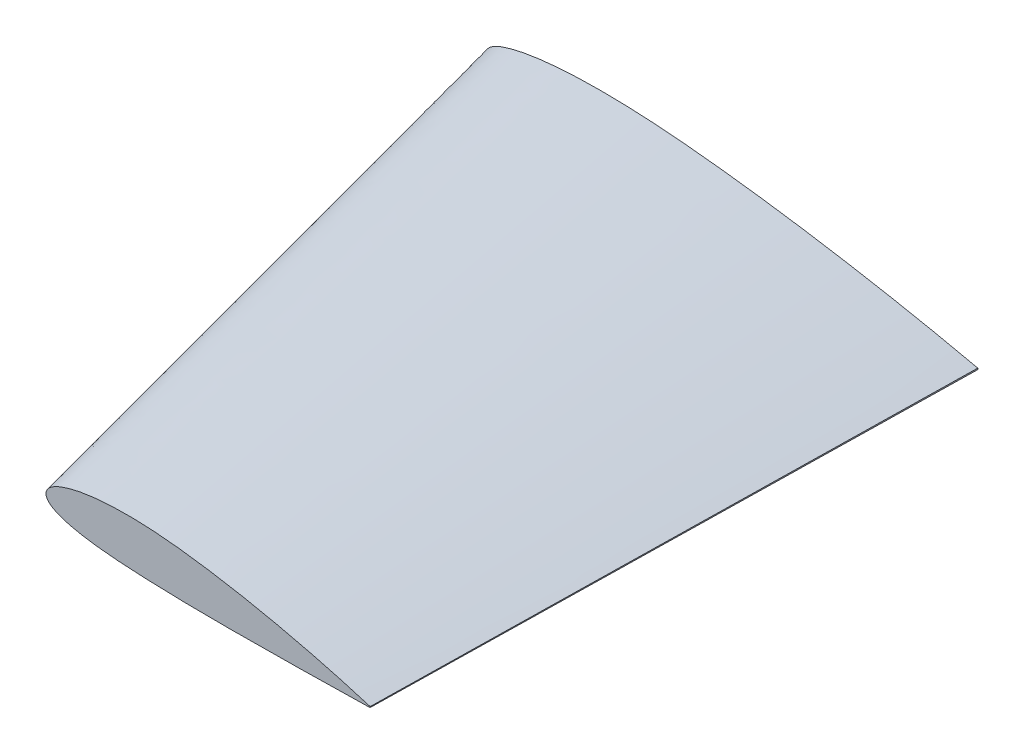
ISO-10303-21;
HEADER;
FILE_DESCRIPTION(('STEP AP214'),'2;1');
FILE_NAME('part.step','',(''),(''),'','','');
FILE_SCHEMA(('AUTOMOTIVE_DESIGN { 1 0 10303 214 1 1 1 1 }'));
ENDSEC;
DATA;
#1=APPLICATION_CONTEXT('core data for automotive mechanical design processes');
#2=APPLICATION_PROTOCOL_DEFINITION('international standard','automotive_design',2000,#1);
#3=PRODUCT_CONTEXT('',#1,'mechanical');
#4=PRODUCT('Part','Part','',(#3));
#5=PRODUCT_RELATED_PRODUCT_CATEGORY('part','',(#4));
#6=PRODUCT_DEFINITION_FORMATION('','',#4);
#7=PRODUCT_DEFINITION_CONTEXT('part definition',#1,'design');
#8=PRODUCT_DEFINITION('design','',#6,#7);
#9=PRODUCT_DEFINITION_SHAPE('','',#8);
#10=(LENGTH_UNIT() NAMED_UNIT(*) SI_UNIT(.MILLI.,.METRE.));
#11=(NAMED_UNIT(*) PLANE_ANGLE_UNIT() SI_UNIT($,.RADIAN.));
#12=(NAMED_UNIT(*) SI_UNIT($,.STERADIAN.) SOLID_ANGLE_UNIT());
#13=UNCERTAINTY_MEASURE_WITH_UNIT(LENGTH_MEASURE(1.E-05),#10,'distance_accuracy_value','');
#14=(GEOMETRIC_REPRESENTATION_CONTEXT(3) GLOBAL_UNCERTAINTY_ASSIGNED_CONTEXT((#13)) GLOBAL_UNIT_ASSIGNED_CONTEXT((#10,
#11,#12)) REPRESENTATION_CONTEXT('',''));
#15=CARTESIAN_POINT('',(0.,0.,0.));
#16=DIRECTION('',(0.,0.,1.));
#17=DIRECTION('',(1.,0.,0.));
#18=AXIS2_PLACEMENT_3D('',#15,#16,#17);
#19=CARTESIAN_POINT('',(119.746151,-7.122289,75.));
#20=DIRECTION('',(-0.997563929784599,0.0697551722889902,-0.000649562653087611));
#21=DIRECTION('',(-0.069755187004952,-0.997564140236558,0.));
#22=AXIS2_PLACEMENT_3D('',#19,#20,#21);
#23=PLANE('',#22);
#24=DIRECTION('',(-0.0679695166424708,-0.974038223353683,-0.215939075327717));
#25=VECTOR('',#24,1.);
#26=CARTESIAN_POINT('',(120.887478722001,8.53859711326182,3.99906070157637));
#27=LINE('',#26,#25);
#28=CARTESIAN_POINT('',(119.720171777671,-8.18951629942968,0.290527241897001));
#29=VERTEX_POINT('',#28);
#30=CARTESIAN_POINT('',(119.69552466197,-8.54271626447592,0.212224694800589));
#31=VERTEX_POINT('',#30);
#32=EDGE_CURVE('E65',#29,#31,#27,.T.);
#33=ORIENTED_EDGE('',*,*,#32,.F.);
#34=DIRECTION('',(-0.000622136728806466,-0.0182076642969266,-0.999834033180878));
#35=VECTOR('',#34,1.);
#36=CARTESIAN_POINT('',(119.813327,-5.463204,150.));
#37=LINE('',#36,#35);
#38=CARTESIAN_POINT('',(119.813327,-5.463204,150.));
#39=VERTEX_POINT('',#38);
#40=EDGE_CURVE('E59',#39,#29,#37,.T.);
#41=ORIENTED_EDGE('',*,*,#40,.F.);
#42=DIRECTION('',(0.0697534354277137,0.997564262714955,0.));
#43=VECTOR('',#42,1.);
#44=CARTESIAN_POINT('',(119.813327,-5.463204,150.));
#45=LINE('',#44,#43);
#46=CARTESIAN_POINT('',(119.796921,-5.697831,150.));
#47=VERTEX_POINT('',#46);
#48=EDGE_CURVE('E85',#47,#39,#45,.T.);
#49=ORIENTED_EDGE('',*,*,#48,.F.);
#50=DIRECTION('',(-0.000676811117803588,-0.018989344322322,-0.999819457066584));
#51=VECTOR('',#50,1.);
#52=CARTESIAN_POINT('',(119.796921,-5.697831,150.));
#53=LINE('',#52,#51);
#54=EDGE_CURVE('E71',#47,#31,#53,.T.);
#55=ORIENTED_EDGE('',*,*,#54,.T.);
#56=EDGE_LOOP('',(#33,#41,#49,#55));
#57=FACE_BOUND('',#56,.T.);
#58=ADVANCED_FACE('F43',(#57),#23,.F.);
#59=CARTESIAN_POINT('',(119.796921,-5.697831,150.));
#60=CARTESIAN_POINT('',(119.695381,-8.546747,0.));
#61=CARTESIAN_POINT('',(119.720089077011,-5.69935452836217,150.));
#62=CARTESIAN_POINT('',(119.580133447658,-8.54903190357948,0.));
#63=CARTESIAN_POINT('',(119.421762984659,-5.70527014579291,150.));
#64=CARTESIAN_POINT('',(119.132644447681,-8.55790384226315,0.));
#65=CARTESIAN_POINT('',(118.757216412402,-5.72393937630763,150.));
#66=CARTESIAN_POINT('',(118.135824981888,-8.58591002334622,0.));
#67=CARTESIAN_POINT('',(117.66284283727,-5.74929339736574,150.));
#68=CARTESIAN_POINT('',(116.494264736278,-8.62393892136286,0.));
#69=CARTESIAN_POINT('',(116.148527112868,-5.78460306429084,150.));
#70=CARTESIAN_POINT('',(114.222791176919,-8.67690443308632,0.));
#71=CARTESIAN_POINT('',(114.232196894729,-5.82484575443327,150.));
#72=CARTESIAN_POINT('',(111.348295660329,-8.73726773433215,0.));
#73=CARTESIAN_POINT('',(111.935984539278,-5.87166832078484,150.));
#74=CARTESIAN_POINT('',(107.903976990949,-8.80750339244512,0.));
#75=CARTESIAN_POINT('',(109.286424235353,-5.92035016143558,150.));
#76=CARTESIAN_POINT('',(103.929636690098,-8.88052584285175,0.));
#77=CARTESIAN_POINT('',(106.313577028821,-5.96913257272703,150.));
#78=CARTESIAN_POINT('',(99.4703658606835,-8.95369832847564,0.));
#79=CARTESIAN_POINT('',(103.051288706592,-6.01950807917383,150.));
#80=CARTESIAN_POINT('',(94.5769335764924,-9.02926375966119,0.));
#81=CARTESIAN_POINT('',(99.5362533327051,-6.06691487761388,150.));
#82=CARTESIAN_POINT('',(89.3043799910391,-9.10037234590575,0.));
#83=CARTESIAN_POINT('',(95.807941331968,-6.10967344012256,150.));
#84=CARTESIAN_POINT('',(83.7119118428322,-9.16451141714926,0.));
#85=CARTESIAN_POINT('',(91.9077441613682,-6.14687179253826,150.));
#86=CARTESIAN_POINT('',(77.8616153918016,-9.22030545810688,0.));
#87=CARTESIAN_POINT('',(87.8789595605144,-6.17278199399079,150.));
#88=CARTESIAN_POINT('',(71.8184388502869,-9.25917464918181,0.));
#89=CARTESIAN_POINT('',(83.7657819445168,-6.18110519907024,150.));
#90=CARTESIAN_POINT('',(65.6486724152118,-9.27165644033003,0.));
#91=CARTESIAN_POINT('',(79.613582340364,-6.16908728967109,150.));
#92=CARTESIAN_POINT('',(59.4203736815377,-9.25363167642656,0.));
#93=CARTESIAN_POINT('',(75.4685289214045,-6.12536899779459,150.));
#94=CARTESIAN_POINT('',(53.2027935297466,-9.18805490680717,0.));
#95=CARTESIAN_POINT('',(71.3878041455055,-6.03697014164122,150.));
#96=CARTESIAN_POINT('',(47.0817064028677,-9.05545478317383,0.));
#97=CARTESIAN_POINT('',(67.4141765351794,-5.92082268573018,150.));
#98=CARTESIAN_POINT('',(41.121264782632,-8.8812343987991,0.));
#99=CARTESIAN_POINT('',(63.5881846045579,-5.77311634705813,150.));
#100=CARTESIAN_POINT('',(35.3822767744536,-8.65967359861637,0.));
#101=CARTESIAN_POINT('',(59.9370733704736,-5.58168107930895,150.));
#102=CARTESIAN_POINT('',(29.9056098858254,-8.37252176780058,0.));
#103=CARTESIAN_POINT('',(56.4981390961885,-5.33465478889035,150.));
#104=CARTESIAN_POINT('',(24.7472081644949,-8.00198251563046,0.));
#105=CARTESIAN_POINT('',(53.306583026596,-5.02653238455898,150.));
#106=CARTESIAN_POINT('',(19.9598742758701,-7.53980000516498,0.));
#107=CARTESIAN_POINT('',(50.3951572901005,-4.65027819780019,150.));
#108=CARTESIAN_POINT('',(15.5927358514262,-6.97541745438635,0.));
#109=CARTESIAN_POINT('',(47.7944372518907,-4.2026716769138,150.));
#110=CARTESIAN_POINT('',(11.6916562954461,-6.30400554721834,0.));
#111=CARTESIAN_POINT('',(45.5309277851159,-3.68571045475573,150.));
#112=CARTESIAN_POINT('',(8.29639119290956,-5.52856724051208,0.));
#113=CARTESIAN_POINT('',(43.6283920681246,-3.09999534114925,150.));
#114=CARTESIAN_POINT('',(5.44258821000201,-4.64999205017269,0.));
#115=CARTESIAN_POINT('',(42.1035247735245,-2.44883989394221,150.));
#116=CARTESIAN_POINT('',(3.15528662789996,-3.67326082160026,0.));
#117=CARTESIAN_POINT('',(40.9645845449649,-1.73486529894164,150.));
#118=CARTESIAN_POINT('',(1.44687693909117,-2.60229725979838,0.));
#119=CARTESIAN_POINT('',(40.2106547036615,-0.931371815462063,150.));
#120=CARTESIAN_POINT('',(0.315982361489284,-1.39705764245588,0.));
#121=CARTESIAN_POINT('',(39.9162153889077,-0.0026750776734886,150.));
#122=CARTESIAN_POINT('',(-0.125677219466628,-0.0040124729912952,0.));
#123=CARTESIAN_POINT('',(40.1556330428731,0.943576027642244,150.));
#124=CARTESIAN_POINT('',(0.233450762508598,1.4153633849593,0.));
#125=CARTESIAN_POINT('',(40.8708763287822,1.78941441957464,150.));
#126=CARTESIAN_POINT('',(1.30631319626383,2.68412251043723,0.));
#127=CARTESIAN_POINT('',(41.986695646897,2.56271001563297,150.));
#128=CARTESIAN_POINT('',(2.9800433907782,3.84406495500664,0.));
#129=CARTESIAN_POINT('',(43.5103075643543,3.27849474912423,150.));
#130=CARTESIAN_POINT('',(5.26546161540701,4.91774163457337,0.));
#131=CARTESIAN_POINT('',(45.4347150322575,3.92547747289718,150.));
#132=CARTESIAN_POINT('',(8.1520728952497,5.88821562020073,0.));
#133=CARTESIAN_POINT('',(47.7453694398953,4.48816110644685,150.));
#134=CARTESIAN_POINT('',(11.6180537630873,6.73224369012464,0.));
#135=CARTESIAN_POINT('',(50.41954469606,4.94538084704893,150.));
#136=CARTESIAN_POINT('',(15.6293171010849,7.41807009203779,0.));
#137=CARTESIAN_POINT('',(53.4269982165544,5.28367379004639,150.));
#138=CARTESIAN_POINT('',(20.140497454147,7.92551034662008,0.));
#139=CARTESIAN_POINT('',(56.7334090785526,5.48468537559014,150.));
#140=CARTESIAN_POINT('',(25.1001141297721,8.22702753372264,0.));
#141=CARTESIAN_POINT('',(60.299715648689,5.54326626088376,150.));
#142=CARTESIAN_POINT('',(30.4495739660976,8.31489879604682,0.));
#143=CARTESIAN_POINT('',(64.0839236547042,5.45152021336018,150.));
#144=CARTESIAN_POINT('',(36.1258856305697,8.17728027790546,0.));
#145=CARTESIAN_POINT('',(68.0413704755695,5.20987884504357,150.));
#146=CARTESIAN_POINT('',(42.0620559623822,7.81481919178412,0.));
#147=CARTESIAN_POINT('',(72.1128083068471,4.82016044703043,150.));
#148=CARTESIAN_POINT('',(48.1692120249969,7.23023970471234,0.));
#149=CARTESIAN_POINT('',(76.2514681863848,4.30472481999823,150.));
#150=CARTESIAN_POINT('',(54.3772018868441,6.45708768257762,0.));
#151=CARTESIAN_POINT('',(80.4133766567728,3.6988830468301,150.));
#152=CARTESIAN_POINT('',(60.6200639533861,5.54832331762684,0.));
#153=CARTESIAN_POINT('',(84.5647854813308,3.01562823356003,150.));
#154=CARTESIAN_POINT('',(66.8471778222922,4.52344373053195,0.));
#155=CARTESIAN_POINT('',(88.6603769940206,2.26722795118617,150.));
#156=CARTESIAN_POINT('',(72.990565092582,3.40084068052255,0.));
#157=CARTESIAN_POINT('',(92.6565544288856,1.47543602771966,150.));
#158=CARTESIAN_POINT('',(78.9848320738078,2.21315438368954,0.));
#159=CARTESIAN_POINT('',(96.5094641766712,0.655201797892603,150.));
#160=CARTESIAN_POINT('',(84.764196939048,0.982802719350695,0.));
#161=CARTESIAN_POINT('',(100.17776634055,-0.176288324365056,150.));
#162=CARTESIAN_POINT('',(90.2666500704411,-0.264432397003351,0.));
#163=CARTESIAN_POINT('',(103.622345902392,-1.00020031780073,150.));
#164=CARTESIAN_POINT('',(95.4335189038481,-1.50030080188002,0.));
#165=CARTESIAN_POINT('',(106.806987105637,-1.80007772210247,150.));
#166=CARTESIAN_POINT('',(100.210480041861,-2.7001181734663,0.));
#167=CARTESIAN_POINT('',(109.698241242375,-2.55722145338107,150.));
#168=CARTESIAN_POINT('',(104.547361928777,-3.83583180699834,0.));
#169=CARTESIAN_POINT('',(112.265941349969,-3.25614582850597,150.));
#170=CARTESIAN_POINT('',(108.398911724082,-4.88421939079952,0.));
#171=CARTESIAN_POINT('',(114.48401058316,-3.87986071176615,150.));
#172=CARTESIAN_POINT('',(111.726015897125,-5.81979074766135,0.));
#173=CARTESIAN_POINT('',(116.329109586423,-4.41525579663681,150.));
#174=CARTESIAN_POINT('',(114.493663788704,-6.62288473287829,0.));
#175=CARTESIAN_POINT('',(117.784271886205,-4.84544497409724,150.));
#176=CARTESIAN_POINT('',(116.676407838735,-7.26816704686535,0.));
#177=CARTESIAN_POINT('',(118.83319885077,-5.16335412260416,150.));
#178=CARTESIAN_POINT('',(118.249798126664,-7.74503165761921,0.));
#179=CARTESIAN_POINT('',(119.465681012099,-5.3525808975048,150.));
#180=CARTESIAN_POINT('',(119.198521990126,-8.02887071528418,0.));
#181=CARTESIAN_POINT('',(119.745098710523,-5.44149333650167,150.));
#182=CARTESIAN_POINT('',(119.617648410054,-8.16224063685609,0.));
#183=CARTESIAN_POINT('',(119.813327,-5.463204,150.));
#184=CARTESIAN_POINT('',(119.719991,-8.194807,0.));
#185=B_SPLINE_SURFACE_WITH_KNOTS('',3,1,((#59,#60),(#61,#62),(#63,#64),(#65,#66),(#67,#68),(#69,
#70),(#71,#72),(#73,#74),(#75,#76),(#77,#78),(#79,#80),(#81,#82),(#83,#84),(#85,#86),(#87,#88),
(#89,#90),(#91,#92),(#93,#94),(#95,#96),(#97,#98),(#99,#100),(#101,#102),(#103,#104),(#105,
#106),(#107,#108),(#109,#110),(#111,#112),(#113,#114),(#115,#116),(#117,#118),(#119,#120),(#121,
#122),(#123,#124),(#125,#126),(#127,#128),(#129,#130),(#131,#132),(#133,#134),(#135,#136),(#137,
#138),(#139,#140),(#141,#142),(#143,#144),(#145,#146),(#147,#148),(#149,#150),(#151,#152),(#153,
#154),(#155,#156),(#157,#158),(#159,#160),(#161,#162),(#163,#164),(#165,#166),(#167,#168),(#169,
#170),(#171,#172),(#173,#174),(#175,#176),(#177,#178),(#179,#180),(#181,#182),(#183,#184)),
.UNSPECIFIED.,.F.,.F.,.F.,(4,1,1,1,1,1,1,1,1,1,1,1,1,1,1,1,1,1,1,1,1,1,1,1,1,1,1,1,1,1,1,1,1,1,
1,1,1,1,1,1,1,1,1,1,1,1,1,1,1,1,1,1,1,1,1,1,1,1,1,1,4),(2,2),(0.,0.00140426639984959,
0.00545255629466779,0.0121483441268653,0.0214077993242185,0.0331320979429333,0.0471743381029762,
0.063376631995686,0.0815572838841061,0.101506317964811,0.122997537633434,0.145795502458062,
0.169640520657042,0.19427144542702,0.219417320947617,0.244803050944842,0.270147100785102,
0.295165349773602,0.319388981425358,0.342790032185736,0.365130697804628,0.386196622663306,
0.40578881072802,0.423715600027115,0.439829198130156,0.453994653991293,0.466115133872475,
0.47616233382913,0.484210204133662,0.490546973712714,0.495899701559383,0.501250622448549,
0.507608162128308,0.515724252713546,0.525914787285248,0.538268455651865,0.552769477827439,
0.569329859155209,0.587812276369091,0.608046386738343,0.629838472377957,0.652971156465722,
0.677200621541474,0.702274678093705,0.727698166522235,0.753405905054719,0.779124875485229,
0.80457568680284,0.829483129372504,0.853566604409608,0.876557773414219,0.898214996265898,
0.91828564740033,0.936559103667118,0.952829355966221,0.966913380007166,0.97866270037821,
0.987936590949606,0.994641798372105,0.998691630481928,1.),(0.,1.),.UNSPECIFIED.);
#186=CARTESIAN_POINT('',(119.720171777671,-8.18951629942968,0.290527241897001));
#187=CARTESIAN_POINT('',(119.682011862439,-8.17732486126337,0.293230018668413));
#188=CARTESIAN_POINT('',(119.643852419115,-8.16513183169179,0.295933148245879));
#189=CARTESIAN_POINT('',(119.567518355628,-8.14079077391738,0.301329430837549));
#190=CARTESIAN_POINT('',(119.529343735417,-8.12864274585608,0.304022583820375));
#191=CARTESIAN_POINT('',(119.452964115157,-8.10444016735785,0.30938816629563));
#192=CARTESIAN_POINT('',(119.414759115659,-8.09238561526516,0.31206059615513));
#193=CARTESIAN_POINT('',(119.338309414249,-8.06839732846219,0.317378671305297));
#194=CARTESIAN_POINT('',(119.300064712399,-8.05646359356874,0.320024316636572));
#195=CARTESIAN_POINT('',(119.185284144146,-8.02081144931929,0.32792820672845));
#196=CARTESIAN_POINT('',(119.108699912114,-7.99724149846271,0.333153539032109));
#197=CARTESIAN_POINT('',(118.955444323165,-7.95037255405629,0.343544133850721));
#198=CARTESIAN_POINT('',(118.87877296582,-7.92707356184019,0.348709396069991));
#199=CARTESIAN_POINT('',(118.725384590885,-7.88062098834096,0.359007683680798));
#200=CARTESIAN_POINT('',(118.648667573547,-7.85746740626288,0.364140709248574));
#201=CARTESIAN_POINT('',(118.49523357753,-7.81116062463915,0.374406675578725));
#202=CARTESIAN_POINT('',(118.418516598851,-7.78800742509291,0.379539616341235));
#203=CARTESIAN_POINT('',(118.188387839244,-7.71847402845557,0.394954799251167));
#204=CARTESIAN_POINT('',(118.034999347572,-7.67202036804985,0.405253327823341));
#205=CARTESIAN_POINT('',(117.72822272972,-7.57908779440366,0.425855983386374));
#206=CARTESIAN_POINT('',(117.574834603878,-7.53260888010469,0.436160110611894));
#207=CARTESIAN_POINT('',(117.268028686261,-7.43974551293174,0.456747423469188));
#208=CARTESIAN_POINT('',(117.114610894554,-7.39336105984609,0.467030609147888));
#209=CARTESIAN_POINT('',(116.65423809528,-7.25458086505628,0.497797437613337));
#210=CARTESIAN_POINT('',(116.347164843475,-7.16255864770561,0.518198272044555));
#211=CARTESIAN_POINT('',(115.732707101145,-6.9793742464009,0.55880927609325));
#212=CARTESIAN_POINT('',(115.425322576128,-6.88821217284901,0.579019421235161));
#213=CARTESIAN_POINT('',(114.810355598084,-6.70652637717675,0.619298192413731));
#214=CARTESIAN_POINT('',(114.502773144892,-6.61600265559362,0.639366818331287));
#215=CARTESIAN_POINT('',(113.579751153644,-6.3453228521322,0.699375086043924));
#216=CARTESIAN_POINT('',(112.964036757873,-6.16605806430005,0.739117132706129));
#217=CARTESIAN_POINT('',(111.73168031644,-5.81057995421876,0.817924732397547));
#218=CARTESIAN_POINT('',(111.115038265603,-5.63436664906721,0.856990281636317));
#219=CARTESIAN_POINT('',(109.880879149434,-5.28488690099267,0.934468076486239));
#220=CARTESIAN_POINT('',(109.263362083968,-5.11162045852704,0.972880321995998));
#221=CARTESIAN_POINT('',(108.027605872214,-4.76777196842112,1.04910969701031));
#222=CARTESIAN_POINT('',(107.409366797433,-4.59718967576341,1.08692688083392));
#223=CARTESIAN_POINT('',(106.172115547931,-4.25871926033137,1.16196396539774));
#224=CARTESIAN_POINT('',(105.553103373518,-4.09083113648141,1.19918386637641));
#225=CARTESIAN_POINT('',(104.314307450816,-3.75777310276794,1.27302105480104));
#226=CARTESIAN_POINT('',(103.694523696955,-3.59260321266034,1.30963833786721));
#227=CARTESIAN_POINT('',(102.454217260856,-3.26492807199017,1.38228216763456));
#228=CARTESIAN_POINT('',(101.833694577877,-3.10242282410359,1.41830871374248));
#229=CARTESIAN_POINT('',(100.384827038029,-2.72621196975097,1.50171265218079));
#230=CARTESIAN_POINT('',(99.556208426393,-2.51351051920872,1.54886742850242));
#231=CARTESIAN_POINT('',(97.8977442221683,-2.09271621527874,1.64215527975425));
#232=CARTESIAN_POINT('',(97.0678986290759,-1.88462336378143,1.68828835426535));
#233=CARTESIAN_POINT('',(95.4069658152783,-1.47315990282839,1.77950760743123));
#234=CARTESIAN_POINT('',(94.5758785754491,-1.26978936692076,1.82459376978078));
#235=CARTESIAN_POINT('',(92.9125072443845,-0.86777296969915,1.91371865933976));
#236=CARTESIAN_POINT('',(92.0802231529515,-0.669127109165039,1.95775738637628));
#237=CARTESIAN_POINT('',(89.5816375414473,-0.0801796241875988,2.08832390037276));
#238=CARTESIAN_POINT('',(87.9136011529234,0.303132282752189,2.1733021042688));
#239=CARTESIAN_POINT('',(84.5714645038029,1.05059000943469,2.33900949282553));
#240=CARTESIAN_POINT('',(82.8973601720202,1.41471849599034,2.41973483481116));
#241=CARTESIAN_POINT('',(80.3828438719596,1.94568141888968,2.53744648087924));
#242=CARTESIAN_POINT('',(79.5441128969079,2.12013054191541,2.57612092035678));
#243=CARTESIAN_POINT('',(77.8655437024502,2.46388196591369,2.65232877633311));
#244=CARTESIAN_POINT('',(77.0257054828101,2.63318426579768,2.68986219259056));
#245=CARTESIAN_POINT('',(75.3449491604743,2.96657973263019,2.76377418813668));
#246=CARTESIAN_POINT('',(74.5040310626786,3.13067292312909,2.80015277264634));
#247=CARTESIAN_POINT('',(72.8211377949584,3.45361277221167,2.87174681354266));
#248=CARTESIAN_POINT('',(71.9791626243745,3.61245942752126,2.90696226920347));
#249=CARTESIAN_POINT('',(70.2201932752817,3.93826697299665,2.97919206308416));
#250=CARTESIAN_POINT('',(69.3030996102124,4.10471671192787,3.01609308180352));
#251=CARTESIAN_POINT('',(67.4675849115224,4.43048916682279,3.08831509628982));
#252=CARTESIAN_POINT('',(66.549163878515,4.58981188607825,3.12363609278651));
#253=CARTESIAN_POINT('',(64.7109751111289,4.90103642672077,3.19263291233046));
#254=CARTESIAN_POINT('',(63.7912073395087,5.05293803874067,3.22630868896213));
#255=CARTESIAN_POINT('',(61.9503999527667,5.34918532158574,3.29198513039135));
#256=CARTESIAN_POINT('',(61.0293603369164,5.49353098808061,3.3239857942289));
#257=CARTESIAN_POINT('',(58.2640518297119,5.91491901982205,3.41740527176759));
#258=CARTESIAN_POINT('',(56.4178839589679,6.180263069272,3.4762306312947));
#259=CARTESIAN_POINT('',(53.6445867333912,6.55215508676274,3.55867710665191));
#260=CARTESIAN_POINT('',(52.7192826543424,6.67178777032299,3.58519903407487));
#261=CARTESIAN_POINT('',(50.8673213941291,6.90068230219745,3.63594373009959));
#262=CARTESIAN_POINT('',(49.9406642164044,7.0099441768291,3.66016650453579));
#263=CARTESIAN_POINT('',(48.0857115587074,7.21656843782699,3.70597400037156));
#264=CARTESIAN_POINT('',(47.1574157176609,7.31392774608943,3.72755803937195));
#265=CARTESIAN_POINT('',(45.2994576949402,7.49537163466307,3.76778318103791));
#266=CARTESIAN_POINT('',(44.3697955146836,7.57945622873909,3.78642428675506));
#267=CARTESIAN_POINT('',(42.5093221777648,7.73296276194369,3.82045586584734));
#268=CARTESIAN_POINT('',(41.5785111936534,7.80238668418327,3.83584677886759));
#269=CARTESIAN_POINT('',(39.7158024410164,7.92565047619067,3.86317370365276));
#270=CARTESIAN_POINT('',(38.7839046715603,7.979490332606,3.8751097124575));
#271=CARTESIAN_POINT('',(36.919813574862,8.0708819663351,3.89537074986546));
#272=CARTESIAN_POINT('',(35.9876207401083,8.10844326157395,3.90369788854187));
#273=CARTESIAN_POINT('',(34.1226514749835,8.16617398377539,3.91649648152445));
#274=CARTESIAN_POINT('',(33.1898750388187,8.1863432352449,3.92096789692474));
#275=CARTESIAN_POINT('',(31.3245497002258,8.20793205857791,3.92575402383041));
#276=CARTESIAN_POINT('',(30.3920009136016,8.20936090334503,3.92607079108903));
#277=CARTESIAN_POINT('',(28.5271150486271,8.19200762507956,3.92222366191822));
#278=CARTESIAN_POINT('',(27.594777963076,8.17322634398168,3.91805995214123));
#279=CARTESIAN_POINT('',(26.29096914708,8.1316988549434,3.90885352946847));
#280=CARTESIAN_POINT('',(25.919176880651,8.11811931229165,3.90584301734145));
#281=CARTESIAN_POINT('',(25.1757521345809,8.08737503023775,3.89902717410331));
#282=CARTESIAN_POINT('',(24.8041196533832,8.07021032659646,3.89522185092019));
#283=CARTESIAN_POINT('',(23.6894871903654,8.01302582843758,3.88254435289245));
#284=CARTESIAN_POINT('',(22.946777265172,7.96731642039338,3.87241082109648));
#285=CARTESIAN_POINT('',(21.8336501000734,7.88620670547873,3.85442923021141));
#286=CARTESIAN_POINT('',(21.4627431004386,7.8570772027199,3.84797137492434));
#287=CARTESIAN_POINT('',(20.7213137942926,7.79444790698429,3.83408679433467));
#288=CARTESIAN_POINT('',(20.3507914874434,7.76094811785043,3.82666006988403));
#289=CARTESIAN_POINT('',(19.6100981324017,7.68933695479312,3.81078425724857));
#290=CARTESIAN_POINT('',(19.2399272288472,7.65122415338684,3.80233485259843));
#291=CARTESIAN_POINT('',(18.500140251559,7.57015824496748,3.78436297337955));
#292=CARTESIAN_POINT('',(18.1305241782327,7.52720513440245,3.77484049802338));
#293=CARTESIAN_POINT('',(17.3936105807986,7.43642283463589,3.75471454670268));
#294=CARTESIAN_POINT('',(17.0263101105186,7.38861647101385,3.7441161310473));
#295=CARTESIAN_POINT('',(16.2924618012588,7.28777087406212,3.72175920045206));
#296=CARTESIAN_POINT('',(15.9259139627134,7.23473163771337,3.71000068484289));
#297=CARTESIAN_POINT('',(15.1937253796605,7.12298928604853,3.68522800188762));
#298=CARTESIAN_POINT('',(14.8280846277212,7.06428621729466,3.67221384486413));
#299=CARTESIAN_POINT('',(14.0978974492585,6.94070129745882,3.64481572775337));
#300=CARTESIAN_POINT('',(13.733351021465,6.87581945355134,3.63043176925665));
#301=CARTESIAN_POINT('',(13.0056298454953,6.73941116688331,3.60019078016208));
#302=CARTESIAN_POINT('',(12.6424548625951,6.66788592028081,3.58433401474609));
#303=CARTESIAN_POINT('',(11.9176488088453,6.51769619913069,3.55103775518328));
#304=CARTESIAN_POINT('',(11.5560177488743,6.43903167436561,3.53359824990351));
#305=CARTESIAN_POINT('',(10.8345114501412,6.27366819406883,3.49693804892566));
#306=CARTESIAN_POINT('',(10.4746370667027,6.18696566970505,3.47771656203654));
#307=CARTESIAN_POINT('',(9.75724092428335,6.00471609255965,3.43731280351447));
#308=CARTESIAN_POINT('',(9.39971911383219,5.90916923397094,3.41613057493306));
#309=CARTESIAN_POINT('',(8.86323289538265,5.75799730964757,3.38261656616911));
#310=CARTESIAN_POINT('',(8.6832102612031,5.70593685021252,3.37107504017761));
#311=CARTESIAN_POINT('',(8.32399319251394,5.59916232710311,3.34740369829801));
#312=CARTESIAN_POINT('',(8.14479875830864,5.54444826245387,3.33527388219378));
#313=CARTESIAN_POINT('',(7.60860707022602,5.37590475990282,3.29790868725506));
#314=CARTESIAN_POINT('',(7.25303640753287,5.25768375835938,3.27169972220058));
#315=CARTESIAN_POINT('',(6.54746972572965,5.0078672091724,3.21631672660595));
#316=CARTESIAN_POINT('',(6.19746601470345,4.87629238622579,3.1871472906205));
#317=CARTESIAN_POINT('',(5.50398449869739,4.59771778744124,3.12538878892207));
#318=CARTESIAN_POINT('',(5.16050444931507,4.45072343438731,3.09280092541137));
#319=CARTESIAN_POINT('',(4.70933099237391,4.24144112720617,3.0464041549237));
#320=CARTESIAN_POINT('',(4.59726747360276,4.1880947838904,3.03457755533908));
#321=CARTESIAN_POINT('',(4.37435887362462,4.07902808064776,3.01039804935812));
#322=CARTESIAN_POINT('',(4.26351376574684,4.02330777281724,2.99804515451128));
#323=CARTESIAN_POINT('',(4.04315170558168,3.9093147762879,2.97277351560205));
#324=CARTESIAN_POINT('',(3.93363529376801,3.85104109064822,2.9598545505232));
#325=CARTESIAN_POINT('',(3.71611817781412,3.7318517209932,2.93343090342691));
#326=CARTESIAN_POINT('',(3.60811749896294,3.67093599296628,2.91992621165233));
#327=CARTESIAN_POINT('',(3.39401081488934,3.54630770332499,2.89229678502454));
#328=CARTESIAN_POINT('',(3.28790244072367,3.482599043175,2.87817291510515));
#329=CARTESIAN_POINT('',(3.07785583577712,3.35187079198547,2.84919115955979));
#330=CARTESIAN_POINT('',(2.97391763755233,3.28485115132666,2.83433326293348));
#331=CARTESIAN_POINT('',(2.66611558359632,3.07832725661352,2.78854801776735));
#332=CARTESIAN_POINT('',(2.46606298276976,2.93324328154739,2.75638367486016));
#333=CARTESIAN_POINT('',(2.18104699286826,2.70605858321185,2.70601803980503));
#334=CARTESIAN_POINT('',(2.09049093775872,2.63058796402406,2.68928660634474));
#335=CARTESIAN_POINT('',(1.91307924086016,2.47556044529098,2.65491783287884));
#336=CARTESIAN_POINT('',(1.82622407197928,2.3960030263723,2.63728037773092));
#337=CARTESIAN_POINT('',(1.65733703403064,2.23227590136139,2.60098294798613));
#338=CARTESIAN_POINT('',(1.57530054316873,2.14811076956207,2.58232398748558));
#339=CARTESIAN_POINT('',(1.41733337962808,1.97447639537878,2.5438301734778));
#340=CARTESIAN_POINT('',(1.34140096904251,1.8850086754,2.52399565747968));
#341=CARTESIAN_POINT('',(1.20996383254227,1.71669404369336,2.4866812019856));
#342=CARTESIAN_POINT('',(1.15322233899967,1.63877033339061,2.46940593131815));
#343=CARTESIAN_POINT('',(1.04588373701373,1.4789385476706,2.43397207750333));
#344=CARTESIAN_POINT('',(0.995287772259353,1.39702973458201,2.41581333081817));
#345=CARTESIAN_POINT('',(0.901296220518763,1.22939302638713,2.37864916734834));
#346=CARTESIAN_POINT('',(0.857897807698852,1.14366664694581,2.35964408657849));
#347=CARTESIAN_POINT('',(0.778919117417438,0.968883612267586,2.3208956206698));
#348=CARTESIAN_POINT('',(0.743334605116321,0.879828791698821,2.30115264226708));
#349=CARTESIAN_POINT('',(0.68776158946777,0.719158696534871,2.2655329397229));
#350=CARTESIAN_POINT('',(0.666065057301467,0.648104642034375,2.249780635081));
#351=CARTESIAN_POINT('',(0.62830567718697,0.504583876179361,2.21796284731251));
#352=CARTESIAN_POINT('',(0.612242012489792,0.43211737123574,2.20189740994612));
#353=CARTESIAN_POINT('',(0.586297403795963,0.286223401628861,2.16955349557249));
#354=CARTESIAN_POINT('',(0.576407399337423,0.212797507427348,2.15327536672823));
#355=CARTESIAN_POINT('',(0.566611559885321,0.102251519564688,2.12876791124249));
#356=CARTESIAN_POINT('',(0.564186144302209,0.065333809498437,2.1205834519638));
#357=CARTESIAN_POINT('',(0.561097028709455,-0.00857168321093457,2.10419899869014));
#358=CARTESIAN_POINT('',(0.560433336532361,-0.0455594661648647,2.09599900462625));
#359=CARTESIAN_POINT('',(0.561063560851131,-0.156699994434618,2.07135974270553));
#360=CARTESIAN_POINT('',(0.564994353187493,-0.2308547276766,2.05492003413608));
#361=CARTESIAN_POINT('',(0.579476477327987,-0.37852144737213,2.02218311052959));
#362=CARTESIAN_POINT('',(0.590029658967863,-0.452033248415769,2.00588593659694));
#363=CARTESIAN_POINT('',(0.631075953407841,-0.671091256978431,1.95732194528941));
#364=CARTESIAN_POINT('',(0.670954522634848,-0.815077666665518,1.92540092676867));
#365=CARTESIAN_POINT('',(0.747197191539921,-1.02519145822817,1.87881982063156));
#366=CARTESIAN_POINT('',(0.775386777728671,-1.09432058335445,1.86349426255789));
#367=CARTESIAN_POINT('',(0.837000807269891,-1.23033115185846,1.83334144545751));
#368=CARTESIAN_POINT('',(0.870424957572714,-1.29721272080802,1.81851415859221));
#369=CARTESIAN_POINT('',(0.977931768420546,-1.49388890932997,1.77491209732794));
#370=CARTESIAN_POINT('',(1.05932292096264,-1.61991574674406,1.74697262012347));
#371=CARTESIAN_POINT('',(1.22774469584877,-1.84852890738426,1.69629030259961));
#372=CARTESIAN_POINT('',(1.31328690834456,-1.95218718111479,1.67330981657477));
#373=CARTESIAN_POINT('',(1.44845098982663,-2.10176961803859,1.64014818868364));
#374=CARTESIAN_POINT('',(1.4946752741321,-2.15067198571217,1.6293067947798));
#375=CARTESIAN_POINT('',(1.58910117448447,-2.24663718690869,1.60803182187508));
#376=CARTESIAN_POINT('',(1.63730306995767,-2.2936997586306,1.59759830091408));
#377=CARTESIAN_POINT('',(1.73556886807514,-2.38631357713901,1.57706631166378));
#378=CARTESIAN_POINT('',(1.78563937295361,-2.43185812069161,1.56696932944566));
#379=CARTESIAN_POINT('',(1.88723298853418,-2.52137856356093,1.5471231250641));
#380=CARTESIAN_POINT('',(1.93875620533351,-2.56535434777096,1.5373739284192));
#381=CARTESIAN_POINT('',(2.09535599558957,-2.69497855151991,1.50863693429872));
#382=CARTESIAN_POINT('',(2.20245272192845,-2.77831448393977,1.49016180287487));
#383=CARTESIAN_POINT('',(2.41062514684656,-2.93158037739445,1.45618357233076));
#384=CARTESIAN_POINT('',(2.51130236492273,-3.00203112804202,1.44056501693301));
#385=CARTESIAN_POINT('',(2.71561868952269,-3.1386753728646,1.41027171717497));
#386=CARTESIAN_POINT('',(2.81925744123385,-3.20486937396514,1.395596860432));
#387=CARTESIAN_POINT('',(3.02913600902197,-3.33360774071025,1.36705625164724));
#388=CARTESIAN_POINT('',(3.13538019520738,-3.39614528066347,1.35319201282479));
#389=CARTESIAN_POINT('',(3.34977318421624,-3.51802503402239,1.32617192202088));
#390=CARTESIAN_POINT('',(3.4579220712851,-3.5773671056183,1.31301610147789));
#391=CARTESIAN_POINT('',(3.67590246452176,-3.69322452136016,1.28733113078032));
#392=CARTESIAN_POINT('',(3.78573520085099,-3.74973765630912,1.27480247039291));
#393=CARTESIAN_POINT('',(4.00682513138783,-3.86002619323486,1.25035209040578));
#394=CARTESIAN_POINT('',(4.11808227970968,-3.91380168312535,1.23843035131605));
#395=CARTESIAN_POINT('',(4.45455073043072,-4.07170579601199,1.20342385227971));
#396=CARTESIAN_POINT('',(4.68166081845534,-4.17199175633822,1.18119099013737));
#397=CARTESIAN_POINT('',(5.13937616498059,-4.3638152686931,1.13866474127887));
#398=CARTESIAN_POINT('',(5.36997715866909,-4.45536263207329,1.11836917943845));
#399=CARTESIAN_POINT('',(5.83387251836534,-4.63146440707081,1.07932835583955));
#400=CARTESIAN_POINT('',(6.06716605175007,-4.71602091778382,1.06058262872277));
#401=CARTESIAN_POINT('',(6.52757615702867,-4.87587519043143,1.02514378967613));
#402=CARTESIAN_POINT('',(6.75461135903064,-4.95139709506074,1.00840098650718));
#403=CARTESIAN_POINT('',(7.21044722464208,-5.09720208583076,0.976076798266758));
#404=CARTESIAN_POINT('',(7.43924797995238,-5.16748489781026,0.960495473975369));
#405=CARTESIAN_POINT('',(7.89842918534209,-5.3034831993211,0.930345376401911));
#406=CARTESIAN_POINT('',(8.12881058063734,-5.36919563547506,0.915777280037314));
#407=CARTESIAN_POINT('',(8.59071727263137,-5.49664491004759,0.887522456106869));
#408=CARTESIAN_POINT('',(8.82224255252783,-5.55838180667638,0.873835715636129));
#409=CARTESIAN_POINT('',(9.28635486007919,-5.67819627480334,0.84727348754498));
#410=CARTESIAN_POINT('',(9.51894217589937,-5.73627278098198,0.834398236100226));
#411=CARTESIAN_POINT('',(9.98497310681925,-5.84904244984657,0.809397802404935));
#412=CARTESIAN_POINT('',(10.2184167220263,-5.90373561210826,0.797272620248454));
#413=CARTESIAN_POINT('',(10.9187512783701,-6.06295607278093,0.761974293933773));
#414=CARTESIAN_POINT('',(11.3867374028497,-6.16290289479782,0.739816616944505));
#415=CARTESIAN_POINT('',(12.3246254604729,-6.35282260520394,0.697712430816779));
#416=CARTESIAN_POINT('',(12.7945266191072,-6.44279917723585,0.677765105034398));
#417=CARTESIAN_POINT('',(13.7359756354127,-6.61387926093732,0.639837563593272));
#418=CARTESIAN_POINT('',(14.2075233526719,-6.69498351101331,0.621857184233761));
#419=CARTESIAN_POINT('',(15.1497865167715,-6.8491717512253,0.587674474336456));
#420=CARTESIAN_POINT('',(15.6204960422759,-6.92229044042227,0.571464451202048));
#421=CARTESIAN_POINT('',(16.562975370047,-7.06190543594881,0.540512551868899));
#422=CARTESIAN_POINT('',(17.0347452460761,-7.12840126600535,0.525770781257352));
#423=CARTESIAN_POINT('',(17.9791411097744,-7.25539531861447,0.497616877606514));
#424=CARTESIAN_POINT('',(18.4517671201404,-7.31589337971943,0.484204780359298));
#425=CARTESIAN_POINT('',(19.3977381550081,-7.43160381775654,0.458552393834395));
#426=CARTESIAN_POINT('',(19.8710832408033,-7.48681571505457,0.446312210889031));
#427=CARTESIAN_POINT('',(20.8183037797124,-7.59255670963675,0.422869996767608));
#428=CARTESIAN_POINT('',(21.2921792141249,-7.64308596708493,0.411667930084038));
#429=CARTESIAN_POINT('',(22.2403741850765,-7.73986763130707,0.390211951684285));
#430=CARTESIAN_POINT('',(22.7146937098124,-7.78612014866419,0.379958015452405));
#431=CARTESIAN_POINT('',(23.7585934184114,-7.88365872264196,0.35833423419973));
#432=CARTESIAN_POINT('',(24.3282561178099,-7.93410183761229,0.347151264843731));
#433=CARTESIAN_POINT('',(25.4680080651213,-8.03018156034174,0.325850903126403));
#434=CARTESIAN_POINT('',(26.0380973161783,-8.07581813231226,0.315733518699218));
#435=CARTESIAN_POINT('',(27.748972771778,-8.2061419048371,0.286841433914965));
#436=CARTESIAN_POINT('',(28.8902884489582,-8.28423598831294,0.269528392424383));
#437=CARTESIAN_POINT('',(31.1740035069035,-8.42625224369553,0.238044146597527));
#438=CARTESIAN_POINT('',(32.3164030286716,-8.4901722083375,0.223873431600076));
#439=CARTESIAN_POINT('',(34.0305146478548,-8.5775787480408,0.204495868267767));
#440=CARTESIAN_POINT('',(34.6020050327985,-8.60530344215295,0.198349451559695));
#441=CARTESIAN_POINT('',(35.7451053939702,-8.65829544754771,0.186601406800931));
#442=CARTESIAN_POINT('',(36.3167153701639,-8.6835627595345,0.180999778594127));
#443=CARTESIAN_POINT('',(37.4600363021856,-8.73190152338158,0.170283332650472));
#444=CARTESIAN_POINT('',(38.0317472587042,-8.75497295958722,0.165168518384173));
#445=CARTESIAN_POINT('',(39.1752480280487,-8.79916630686027,0.155371089169413));
#446=CARTESIAN_POINT('',(39.7470378408862,-8.82028821764173,0.150688474284343));
#447=CARTESIAN_POINT('',(40.891288207406,-8.86087371582084,0.14169088595733));
#448=CARTESIAN_POINT('',(41.4637488273901,-8.88033551470845,0.137376309018518));
#449=CARTESIAN_POINT('',(42.6087218742253,-8.91774005172017,0.129083922804389));
#450=CARTESIAN_POINT('',(43.1812343010664,-8.9356827901346,0.125106113464712));
#451=CARTESIAN_POINT('',(44.8987028345265,-8.98736894092994,0.113647569700826));
#452=CARTESIAN_POINT('',(46.0437265661837,-9.01897507259739,0.106640659003363));
#453=CARTESIAN_POINT('',(48.3338108793742,-9.07722546141567,0.0937268587054752));
#454=CARTESIAN_POINT('',(49.4788714497578,-9.10387013459851,0.0878198768729734));
#455=CARTESIAN_POINT('',(51.1965349141935,-9.13918770466291,0.0799901600921777));
#456=CARTESIAN_POINT('',(51.7690876643553,-9.15018511177538,0.077552093632432));
#457=CARTESIAN_POINT('',(52.9142251923566,-9.17045695084905,0.0730579351078441));
#458=CARTESIAN_POINT('',(53.4868099701886,-9.17973138320994,0.0710018429543917));
#459=CARTESIAN_POINT('',(54.6320018658321,-9.19656081487677,0.0672708477785411));
#460=CARTESIAN_POINT('',(55.2046089834574,-9.20411582631649,0.0655959420661489));
#461=CARTESIAN_POINT('',(56.3498423699649,-9.21769136467602,0.0625863176693353));
#462=CARTESIAN_POINT('',(56.9224686388563,-9.223711890839,0.0612515991526989));
#463=CARTESIAN_POINT('',(58.3607246974267,-9.23709517719255,0.0582845959994958));
#464=CARTESIAN_POINT('',(59.2263631927472,-9.24356858448293,0.0568494761541069));
#465=CARTESIAN_POINT('',(60.9576568481043,-9.25386335656214,0.0545671801310219));
#466=CARTESIAN_POINT('',(61.8233120081554,-9.25768471891604,0.053720004493135));
#467=CARTESIAN_POINT('',(63.5546692991733,-9.26306507570414,0.0525272081100985));
#468=CARTESIAN_POINT('',(64.4203714304652,-9.26462396578281,0.0521816105000113));
#469=CARTESIAN_POINT('',(66.1517767123077,-9.26591478602979,0.051895442540825));
#470=CARTESIAN_POINT('',(67.0174798628581,-9.265646716558,0.0519548721119368));
#471=CARTESIAN_POINT('',(68.7489314055001,-9.26339319675639,0.0524544654241144));
#472=CARTESIAN_POINT('',(69.6146797974622,-9.26140765200906,0.0528946500970358));
#473=CARTESIAN_POINT('',(71.3461707121654,-9.25576446146999,0.0541457153198251));
#474=CARTESIAN_POINT('',(72.2119132349072,-9.2521068158633,0.0549565958286677));
#475=CARTESIAN_POINT('',(73.9434324170079,-9.24324656084298,0.056920867076328));
#476=CARTESIAN_POINT('',(74.809209075954,-9.23804387552172,0.0580742746434634));
#477=CARTESIAN_POINT('',(76.5407528427816,-9.22630041550582,0.060677737049948));
#478=CARTESIAN_POINT('',(77.4065199506623,-9.21975964068449,0.062127791917386));
#479=CARTESIAN_POINT('',(80.0038678204246,-9.19840387420544,0.0668622513624393));
#480=CARTESIAN_POINT('',(81.7354335160121,-9.18185578267422,0.0705308749318375));
#481=CARTESIAN_POINT('',(85.1985590336936,-9.14567851020253,0.0785511831477907));
#482=CARTESIAN_POINT('',(86.9301188552191,-9.12604927842533,0.0829028790645775));
#483=CARTESIAN_POINT('',(89.5239181920952,-9.09418384894792,0.0899672747025452));
#484=CARTESIAN_POINT('',(90.3861736520054,-9.083183316781,0.0924060339701826));
#485=CARTESIAN_POINT('',(92.1106728511602,-9.06034492689351,0.0974691831115984));
#486=CARTESIAN_POINT('',(92.9729165904061,-9.04850706927519,0.100093572962707));
#487=CARTESIAN_POINT('',(94.6973725746164,-9.02396305961876,0.105534848903392));
#488=CARTESIAN_POINT('',(95.5595848198594,-9.01125692623248,0.10835173085796));
#489=CARTESIAN_POINT('',(97.2839976113434,-8.98510081981164,0.114150400046981));
#490=CARTESIAN_POINT('',(98.1461981575814,-8.97165084659158,0.117132187322559));
#491=CARTESIAN_POINT('',(99.8705502108102,-8.94428520987873,0.123199002921622));
#492=CARTESIAN_POINT('',(100.732701718173,-8.93036956870082,0.126284026298021));
#493=CARTESIAN_POINT('',(102.456992459773,-8.901842140239,0.132608404926934));
#494=CARTESIAN_POINT('',(103.319131694014,-8.88723035319349,0.1358477601266));
#495=CARTESIAN_POINT('',(105.043325394882,-8.85695617127488,0.142559384673836));
#496=CARTESIAN_POINT('',(105.905379862972,-8.84129385633112,0.146031636301499));
#497=CARTESIAN_POINT('',(107.198444589218,-8.81693604830615,0.151431632334317));
#498=CARTESIAN_POINT('',(107.629463423014,-8.80867272126036,0.153263567836042));
#499=CARTESIAN_POINT('',(108.491494888875,-8.79184292779657,0.156994643220346));
#500=CARTESIAN_POINT('',(108.92250752094,-8.78327646137485,0.158893783103753));
#501=CARTESIAN_POINT('',(109.784483872478,-8.76590942975968,0.162743961318785));
#502=CARTESIAN_POINT('',(110.21544759246,-8.75710888851281,0.164694994341587));
#503=CARTESIAN_POINT('',(111.077371915013,-8.73936271778767,0.1686292256737));
#504=CARTESIAN_POINT('',(111.508332517583,-8.73041708830099,0.170612423984879));
#505=CARTESIAN_POINT('',(112.370250550459,-8.7123859182929,0.174609838136879));
#506=CARTESIAN_POINT('',(112.801207980765,-8.70330037780836,0.176624053969528));
#507=CARTESIAN_POINT('',(113.663115009582,-8.68478139038012,0.18072961463992));
#508=CARTESIAN_POINT('',(114.094064608094,-8.67534794348665,0.182820959466528));
#509=CARTESIAN_POINT('',(114.740453261243,-8.66082408756371,0.186040820805639));
#510=CARTESIAN_POINT('',(114.955896735582,-8.65592083918183,0.187127844801514));
#511=CARTESIAN_POINT('',(115.386781832463,-8.64603605794607,0.189319248042876));
#512=CARTESIAN_POINT('',(115.602223455004,-8.64105452507814,0.190423627291476));
#513=CARTESIAN_POINT('',(116.033105579982,-8.63104341963709,0.192643035934911));
#514=CARTESIAN_POINT('',(116.248546082418,-8.62601384705232,0.193758065332331));
#515=CARTESIAN_POINT('',(116.679427412361,-8.61597108435043,0.195984492221531));
#516=CARTESIAN_POINT('',(116.894868239866,-8.61095789422784,0.197095889714523));
#517=CARTESIAN_POINT('',(117.325747733216,-8.60083134254739,0.199340892173055));
#518=CARTESIAN_POINT('',(117.541186399057,-8.59571798086056,0.200474497167188));
#519=CARTESIAN_POINT('',(117.972055029623,-8.58514447313783,0.202818587394732));
#520=CARTESIAN_POINT('',(118.187484994346,-8.57968432698389,0.204029072654309));
#521=CARTESIAN_POINT('',(118.510620125602,-8.57113295157347,0.205924866941057));
#522=CARTESIAN_POINT('',(118.618330338767,-8.5682222964254,0.206570143652178));
#523=CARTESIAN_POINT('',(118.833752902405,-8.56248391952284,0.207842311183709));
#524=CARTESIAN_POINT('',(118.941465252874,-8.55965619761529,0.208469202038051));
#525=CARTESIAN_POINT('',(119.156896867868,-8.55426543015046,0.209664306412553));
#526=CARTESIAN_POINT('',(119.264616132377,-8.55170238395481,0.210232520074236));
#527=CARTESIAN_POINT('',(119.426202775078,-8.54817722503815,0.211014028991029));
#528=CARTESIAN_POINT('',(119.48006652201,-8.54705540281163,0.211262730991082));
#529=CARTESIAN_POINT('',(119.587795108568,-8.54486210540145,0.211748973320506));
#530=CARTESIAN_POINT('',(119.641659948193,-8.54379063022535,0.2119865136482));
#531=CARTESIAN_POINT('',(119.69552466197,-8.54271626447592,0.212224694800572));
#532=B_SPLINE_CURVE_WITH_KNOTS('',3,(#186,#187,#188,#189,#190,#191,#192,#193,#194,#195,#196,
#197,#198,#199,#200,#201,#202,#203,#204,#205,#206,#207,#208,#209,#210,#211,#212,#213,#214,#215,
#216,#217,#218,#219,#220,#221,#222,#223,#224,#225,#226,#227,#228,#229,#230,#231,#232,#233,#234,
#235,#236,#237,#238,#239,#240,#241,#242,#243,#244,#245,#246,#247,#248,#249,#250,#251,#252,#253,
#254,#255,#256,#257,#258,#259,#260,#261,#262,#263,#264,#265,#266,#267,#268,#269,#270,#271,#272,
#273,#274,#275,#276,#277,#278,#279,#280,#281,#282,#283,#284,#285,#286,#287,#288,#289,#290,#291,
#292,#293,#294,#295,#296,#297,#298,#299,#300,#301,#302,#303,#304,#305,#306,#307,#308,#309,#310,
#311,#312,#313,#314,#315,#316,#317,#318,#319,#320,#321,#322,#323,#324,#325,#326,#327,#328,#329,
#330,#331,#332,#333,#334,#335,#336,#337,#338,#339,#340,#341,#342,#343,#344,#345,#346,#347,#348,
#349,#350,#351,#352,#353,#354,#355,#356,#357,#358,#359,#360,#361,#362,#363,#364,#365,#366,#367,
#368,#369,#370,#371,#372,#373,#374,#375,#376,#377,#378,#379,#380,#381,#382,#383,#384,#385,#386,
#387,#388,#389,#390,#391,#392,#393,#394,#395,#396,#397,#398,#399,#400,#401,#402,#403,#404,#405,
#406,#407,#408,#409,#410,#411,#412,#413,#414,#415,#416,#417,#418,#419,#420,#421,#422,#423,#424,
#425,#426,#427,#428,#429,#430,#431,#432,#433,#434,#435,#436,#437,#438,#439,#440,#441,#442,#443,
#444,#445,#446,#447,#448,#449,#450,#451,#452,#453,#454,#455,#456,#457,#458,#459,#460,#461,#462,
#463,#464,#465,#466,#467,#468,#469,#470,#471,#472,#473,#474,#475,#476,#477,#478,#479,#480,#481,
#482,#483,#484,#485,#486,#487,#488,#489,#490,#491,#492,#493,#494,#495,#496,#497,#498,#499,#500,
#501,#502,#503,#504,#505,#506,#507,#508,#509,#510,#511,#512,#513,#514,#515,#516,#517,#518,#519,
#520,#521,#522,#523,#524,#525,#526,#527,#528,#529,#530,#531),.UNSPECIFIED.,.F.,.F.,(4,2,2,2,2,2,
2,2,2,2,2,2,2,2,2,2,2,2,2,2,2,2,2,2,2,2,2,2,2,2,2,2,2,2,2,2,2,2,2,2,2,2,2,2,2,2,2,2,2,2,2,2,2,2,
2,2,2,2,2,2,2,2,2,2,2,2,2,2,2,2,2,2,2,2,2,2,2,2,2,2,2,2,2,2,2,2,2,2,2,2,2,2,2,2,2,2,2,2,2,2,2,2,
2,2,2,2,2,2,2,2,2,2,2,2,2,2,2,2,2,2,2,2,2,2,2,2,2,2,2,2,2,2,2,2,2,2,2,2,2,2,2,2,2,2,2,2,2,2,2,2,
2,2,2,2,2,2,2,2,2,2,2,2,2,2,2,2,2,2,2,2,2,2,4),(0.,0.120453566704012,0.240907511942641,
0.361359318672735,0.481810942761497,0.722708190076472,0.963606622665302,1.20450373710714,
1.44540041893932,1.92719727589542,2.40901618433847,2.89083401194425,3.85447337560682,
4.81823478730732,5.78199701001162,7.70952074650896,9.63705527951608,11.564590111673,
13.4919479596954,15.4193050382195,17.3466761184482,19.2740491341431,21.8443788164991,
24.414709553171,26.9850802948624,29.5554514608267,34.6961890538744,39.841494585928,
42.4141406661523,44.9867872904962,47.5594222822457,50.1320588794106,52.9304503478308,
55.7288405237487,58.5273096034051,61.3257802868405,66.9236066756904,69.7237124437331,
72.5238111059076,75.3246323722141,78.1254507342715,80.9258899938847,83.7263316529163,
86.5251337031317,89.3239639941137,92.1214093491334,94.9187381697393,96.0348800905482,
97.1510108787264,99.3833477077265,100.499642081565,101.615935473818,102.73257518714,
103.849215719884,104.960828521715,106.072441964882,107.184046270283,108.295649284962,
109.407052539833,110.518463612886,111.630370532077,112.742253043186,113.305496902759,
113.868740969258,114.995338172733,116.120212921118,117.244693388288,117.618695278902,
117.992688966317,118.366830000178,118.740977268941,119.114617579265,119.488263490766,
120.234857355302,120.591946174472,120.949080487304,121.305866468058,121.662550505002,
121.956098921033,122.249701883284,122.543189299671,122.836517262201,123.064149379535,
123.291748477229,123.519012760368,123.632652186136,123.746292117138,123.974110259931,
124.201992067638,124.65800582602,124.886488449088,125.114958285451,125.571248904905,
125.979650529908,126.184080338145,126.388539131416,126.593805450778,126.79908680057,
127.209690914219,127.581175232849,127.952615230112,128.32472781961,128.696856909286,
129.069272210993,129.441675545812,130.189200091251,130.935875222603,131.682325334444,
132.401805678122,133.121323645747,133.841317781251,134.561301372139,135.281493548451,
136.001685815073,137.438687120713,138.875155724158,140.311504685199,141.741340752029,
143.171279569259,144.601256867058,146.031363789521,147.461421778836,148.891442780964,
150.607420068999,152.323410132973,155.755625954402,159.18837588291,160.904957756153,
162.6215391375,164.338132755642,166.054726625566,167.773147094409,169.491567234838,
172.927998140729,176.364140762496,178.082129027937,179.800116894841,181.518092637703,
183.236069227892,185.833055367653,188.430043891782,191.027152197039,193.624259990674,
196.22151056832,198.818760858524,201.416138772474,204.013516932362,209.208458091634,
214.403484972933,216.990471804604,219.577458320343,222.164389281316,224.751320887444,
227.338128704534,229.924935635819,232.511545972862,233.804851667674,235.098157378429,
236.391331285229,237.684505267166,238.977678908364,240.270852362862,240.917358350886,
241.563864454903,242.210370715872,242.856876761037,243.503383638637,244.149890736269,
244.473145117753,244.796398902616,245.119651907807,245.281279860888,245.442907838254),.UNSPECIFIED.);
#533=EDGE_CURVE('E11',#29,#31,#532,.T.);
#534=CARTESIAN_POINT('',(119.813327,-5.463204,150.));
#535=CARTESIAN_POINT('',(119.745098710523,-5.44149333650167,150.));
#536=CARTESIAN_POINT('',(119.465681012099,-5.3525808975048,150.));
#537=CARTESIAN_POINT('',(118.83319885077,-5.16335412260416,150.));
#538=CARTESIAN_POINT('',(117.784271886205,-4.84544497409724,150.));
#539=CARTESIAN_POINT('',(116.329109586423,-4.41525579663681,150.));
#540=CARTESIAN_POINT('',(114.48401058316,-3.87986071176615,150.));
#541=CARTESIAN_POINT('',(112.265941349969,-3.25614582850597,150.));
#542=CARTESIAN_POINT('',(109.698241242375,-2.55722145338107,150.));
#543=CARTESIAN_POINT('',(106.806987105637,-1.80007772210247,150.));
#544=CARTESIAN_POINT('',(103.622345902392,-1.00020031780073,150.));
#545=CARTESIAN_POINT('',(100.17776634055,-0.176288324365056,150.));
#546=CARTESIAN_POINT('',(96.5094641766712,0.655201797892603,150.));
#547=CARTESIAN_POINT('',(92.6565544288856,1.47543602771966,150.));
#548=CARTESIAN_POINT('',(88.6603769940206,2.26722795118617,150.));
#549=CARTESIAN_POINT('',(84.5647854813308,3.01562823356003,150.));
#550=CARTESIAN_POINT('',(80.4133766567728,3.6988830468301,150.));
#551=CARTESIAN_POINT('',(76.2514681863848,4.30472481999823,150.));
#552=CARTESIAN_POINT('',(72.1128083068471,4.82016044703043,150.));
#553=CARTESIAN_POINT('',(68.0413704755695,5.20987884504357,150.));
#554=CARTESIAN_POINT('',(64.0839236547042,5.45152021336018,150.));
#555=CARTESIAN_POINT('',(60.299715648689,5.54326626088376,150.));
#556=CARTESIAN_POINT('',(56.7334090785526,5.48468537559014,150.));
#557=CARTESIAN_POINT('',(53.4269982165544,5.28367379004639,150.));
#558=CARTESIAN_POINT('',(50.41954469606,4.94538084704893,150.));
#559=CARTESIAN_POINT('',(47.7453694398953,4.48816110644685,150.));
#560=CARTESIAN_POINT('',(45.4347150322575,3.92547747289718,150.));
#561=CARTESIAN_POINT('',(43.5103075643543,3.27849474912423,150.));
#562=CARTESIAN_POINT('',(41.986695646897,2.56271001563297,150.));
#563=CARTESIAN_POINT('',(40.8708763287822,1.78941441957464,150.));
#564=CARTESIAN_POINT('',(40.1556330428731,0.943576027642244,150.));
#565=CARTESIAN_POINT('',(39.9162153889077,-0.0026750776734886,150.));
#566=CARTESIAN_POINT('',(40.2106547036615,-0.931371815462063,150.));
#567=CARTESIAN_POINT('',(40.9645845449649,-1.73486529894164,150.));
#568=CARTESIAN_POINT('',(42.1035247735245,-2.44883989394221,150.));
#569=CARTESIAN_POINT('',(43.6283920681246,-3.09999534114925,150.));
#570=CARTESIAN_POINT('',(45.5309277851159,-3.68571045475573,150.));
#571=CARTESIAN_POINT('',(47.7944372518907,-4.2026716769138,150.));
#572=CARTESIAN_POINT('',(50.3951572901005,-4.65027819780019,150.));
#573=CARTESIAN_POINT('',(53.306583026596,-5.02653238455898,150.));
#574=CARTESIAN_POINT('',(56.4981390961885,-5.33465478889035,150.));
#575=CARTESIAN_POINT('',(59.9370733704736,-5.58168107930895,150.));
#576=CARTESIAN_POINT('',(63.5881846045579,-5.77311634705813,150.));
#577=CARTESIAN_POINT('',(67.4141765351794,-5.92082268573018,150.));
#578=CARTESIAN_POINT('',(71.3878041455055,-6.03697014164122,150.));
#579=CARTESIAN_POINT('',(75.4685289214045,-6.12536899779459,150.));
#580=CARTESIAN_POINT('',(79.613582340364,-6.16908728967109,150.));
#581=CARTESIAN_POINT('',(83.7657819445168,-6.18110519907024,150.));
#582=CARTESIAN_POINT('',(87.8789595605144,-6.17278199399079,150.));
#583=CARTESIAN_POINT('',(91.9077441613682,-6.14687179253826,150.));
#584=CARTESIAN_POINT('',(95.807941331968,-6.10967344012256,150.));
#585=CARTESIAN_POINT('',(99.5362533327051,-6.06691487761388,150.));
#586=CARTESIAN_POINT('',(103.051288706592,-6.01950807917383,150.));
#587=CARTESIAN_POINT('',(106.313577028821,-5.96913257272703,150.));
#588=CARTESIAN_POINT('',(109.286424235353,-5.92035016143558,150.));
#589=CARTESIAN_POINT('',(111.935984539278,-5.87166832078484,150.));
#590=CARTESIAN_POINT('',(114.232196894729,-5.82484575443327,150.));
#591=CARTESIAN_POINT('',(116.148527112868,-5.78460306429084,150.));
#592=CARTESIAN_POINT('',(117.66284283727,-5.74929339736574,150.));
#593=CARTESIAN_POINT('',(118.757216412402,-5.72393937630763,150.));
#594=CARTESIAN_POINT('',(119.421762984659,-5.70527014579291,150.));
#595=CARTESIAN_POINT('',(119.720089077011,-5.69935452836217,150.));
#596=CARTESIAN_POINT('',(119.796921,-5.697831,150.));
#597=B_SPLINE_CURVE_WITH_KNOTS('',3,(#534,#535,#536,#537,#538,#539,#540,#541,#542,#543,#544,
#545,#546,#547,#548,#549,#550,#551,#552,#553,#554,#555,#556,#557,#558,#559,#560,#561,#562,#563,
#564,#565,#566,#567,#568,#569,#570,#571,#572,#573,#574,#575,#576,#577,#578,#579,#580,#581,#582,
#583,#584,#585,#586,#587,#588,#589,#590,#591,#592,#593,#594,#595,#596),.UNSPECIFIED.,.F.,.F.,(4,
1,1,1,1,1,1,1,1,1,1,1,1,1,1,1,1,1,1,1,1,1,1,1,1,1,1,1,1,1,1,1,1,1,1,1,1,1,1,1,1,1,1,1,1,1,1,1,1,
1,1,1,1,1,1,1,1,1,1,1,4),(0.,0.00130836635657932,0.00535819846656844,0.0120634058893427,
0.0213372950911126,0.0330866148974405,0.0471706433979654,0.0634408912462413,0.0817143485429148,
0.101785001152944,0.123442225507798,0.146433395590392,0.170516869545728,0.195424308527528,
0.220875119117892,0.246594088204854,0.27230182644665,0.297725321169948,0.322799373298068,
0.347028842550705,0.370161526686606,0.391953612327114,0.412187722697197,0.43067013587736,
0.447230518252345,0.461731544348135,0.474085209227469,0.48427574286232,0.492391834645729,
0.498749373591418,0.504100296008657,0.50945302580549,0.515789792521623,0.52383766617087,
0.533884862291248,0.546005345432156,0.560170800701887,0.576284396104929,0.594211188901509,
0.613803377165532,0.634869302172798,0.657209963846083,0.680611018574642,0.70483464820832,
0.729852893052271,0.75519694900701,0.780582676988478,0.80572855457298,0.830359479281498,
0.854204497541938,0.877002456273256,0.898493680030599,0.918442712019848,0.936623363942717,
0.95282565986615,0.9668678999448,0.978592194504115,0.987851651731716,0.994547441643141,
0.998595729456764,1.),.UNSPECIFIED.);
#598=EDGE_CURVE('E81',#39,#47,#597,.T.);
#599=ORIENTED_EDGE('',*,*,#40,.T.);
#600=ORIENTED_EDGE('',*,*,#533,.T.);
#601=ORIENTED_EDGE('',*,*,#54,.F.);
#602=ORIENTED_EDGE('',*,*,#598,.F.);
#603=EDGE_LOOP('',(#599,#600,#601,#602));
#604=FACE_BOUND('',#603,.T.);
#605=ADVANCED_FACE('F45',(#604),#185,.T.);
#606=CARTESIAN_POINT('',(40.1141843223744,0.665612657062489,150.));
#607=DIRECTION('',(0.,0.,-1.));
#608=DIRECTION('',(-1.,0.,0.));
#609=AXIS2_PLACEMENT_3D('',#606,#607,#608);
#610=PLANE('',#609);
#611=ORIENTED_EDGE('',*,*,#598,.T.);
#612=ORIENTED_EDGE('',*,*,#48,.T.);
#613=EDGE_LOOP('',(#611,#612));
#614=FACE_BOUND('',#613,.T.);
#615=ADVANCED_FACE('F94',(#614),#610,.F.);
#616=CARTESIAN_POINT('',(119.813327,-9.5,0.));
#617=DIRECTION('',(0.,0.216439613938097,-0.976296007119935));
#618=DIRECTION('',(0.,0.976296007119935,0.216439613938097));
#619=AXIS2_PLACEMENT_3D('',#616,#617,#618);
#620=PLANE('',#619);
#621=ORIENTED_EDGE('',*,*,#32,.T.);
#622=ORIENTED_EDGE('',*,*,#533,.F.);
#623=EDGE_LOOP('',(#621,#622));
#624=FACE_BOUND('',#623,.T.);
#625=ADVANCED_FACE('F77',(#624),#620,.T.);
#626=CLOSED_SHELL('',(#58,#605,#615,#625));
#627=MANIFOLD_SOLID_BREP('B2',#626);
#628=ADVANCED_BREP_SHAPE_REPRESENTATION('',(#18,#627),#14);
#629=SHAPE_DEFINITION_REPRESENTATION(#9,#628);
ENDSEC;
END-ISO-10303-21;
